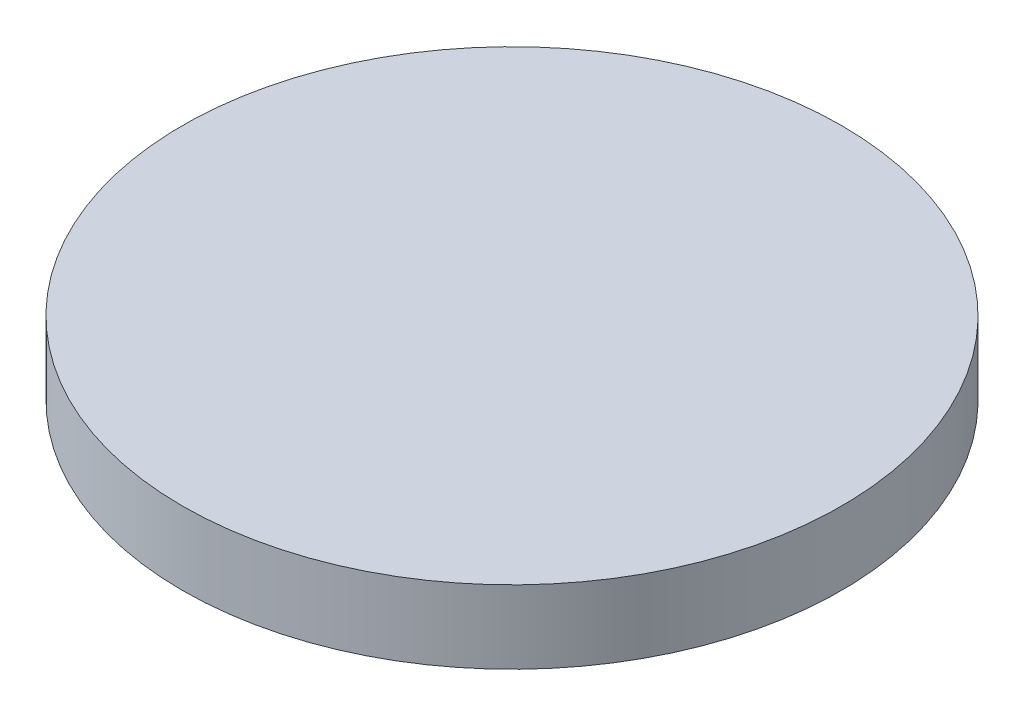
ISO-10303-21;
HEADER;
FILE_DESCRIPTION(('STEP AP214'),'2;1');
FILE_NAME('part.step','',(''),(''),'','','');
FILE_SCHEMA(('AUTOMOTIVE_DESIGN { 1 0 10303 214 1 1 1 1 }'));
ENDSEC;
DATA;
#1=APPLICATION_CONTEXT('core data for automotive mechanical design processes');
#2=APPLICATION_PROTOCOL_DEFINITION('international standard','automotive_design',2000,#1);
#3=PRODUCT_CONTEXT('',#1,'mechanical');
#4=PRODUCT('Part','Part','',(#3));
#5=PRODUCT_RELATED_PRODUCT_CATEGORY('part','',(#4));
#6=PRODUCT_DEFINITION_FORMATION('','',#4);
#7=PRODUCT_DEFINITION_CONTEXT('part definition',#1,'design');
#8=PRODUCT_DEFINITION('design','',#6,#7);
#9=PRODUCT_DEFINITION_SHAPE('','',#8);
#10=(LENGTH_UNIT() NAMED_UNIT(*) SI_UNIT(.MILLI.,.METRE.));
#11=(NAMED_UNIT(*) PLANE_ANGLE_UNIT() SI_UNIT($,.RADIAN.));
#12=(NAMED_UNIT(*) SI_UNIT($,.STERADIAN.) SOLID_ANGLE_UNIT());
#13=UNCERTAINTY_MEASURE_WITH_UNIT(LENGTH_MEASURE(1.E-05),#10,'distance_accuracy_value','');
#14=(GEOMETRIC_REPRESENTATION_CONTEXT(3) GLOBAL_UNCERTAINTY_ASSIGNED_CONTEXT((#13)) GLOBAL_UNIT_ASSIGNED_CONTEXT((#10,
#11,#12)) REPRESENTATION_CONTEXT('',''));
#15=CARTESIAN_POINT('',(0.,0.,0.));
#16=DIRECTION('',(0.,0.,1.));
#17=DIRECTION('',(1.,0.,0.));
#18=AXIS2_PLACEMENT_3D('',#15,#16,#17);
#19=CARTESIAN_POINT('',(0.,0.,5.5));
#20=DIRECTION('',(0.,-1.,0.));
#21=DIRECTION('',(0.,0.,-1.));
#22=AXIS2_PLACEMENT_3D('',#19,#20,#21);
#23=CYLINDRICAL_SURFACE('',#22,10.);
#24=CARTESIAN_POINT('',(0.,2.21893410709426,5.5));
#25=DIRECTION('',(0.,-1.,0.));
#26=DIRECTION('',(0.,0.,-1.));
#27=AXIS2_PLACEMENT_3D('',#24,#25,#26);
#28=CIRCLE('',#27,10.);
#29=CARTESIAN_POINT('',(0.,2.21893410709426,-4.5));
#30=VERTEX_POINT('',#29);
#31=EDGE_CURVE('E37',#30,#30,#28,.T.);
#32=ORIENTED_EDGE('',*,*,#31,.T.);
#33=EDGE_LOOP('',(#32));
#34=FACE_BOUND('',#33,.T.);
#35=CARTESIAN_POINT('',(0.,0.,5.5));
#36=DIRECTION('',(0.,-1.,0.));
#37=DIRECTION('',(0.,0.,-1.));
#38=AXIS2_PLACEMENT_3D('',#35,#36,#37);
#39=CIRCLE('',#38,10.);
#40=CARTESIAN_POINT('',(0.,0.,-4.5));
#41=VERTEX_POINT('',#40);
#42=EDGE_CURVE('E10',#41,#41,#39,.T.);
#43=ORIENTED_EDGE('',*,*,#42,.F.);
#44=EDGE_LOOP('',(#43));
#45=FACE_BOUND('',#44,.T.);
#46=ADVANCED_FACE('F31',(#34,#45),#23,.T.);
#47=CARTESIAN_POINT('',(0.,0.,-4.5));
#48=DIRECTION('',(0.,1.,0.));
#49=DIRECTION('',(0.,0.,1.));
#50=AXIS2_PLACEMENT_3D('',#47,#48,#49);
#51=PLANE('',#50);
#52=ORIENTED_EDGE('',*,*,#42,.T.);
#53=EDGE_LOOP('',(#52));
#54=FACE_BOUND('',#53,.T.);
#55=ADVANCED_FACE('F47',(#54),#51,.F.);
#56=CARTESIAN_POINT('',(0.,2.21893410709426,5.5));
#57=DIRECTION('',(0.,-1.,0.));
#58=DIRECTION('',(0.,0.,-1.));
#59=AXIS2_PLACEMENT_3D('',#56,#57,#58);
#60=PLANE('',#59);
#61=ORIENTED_EDGE('',*,*,#31,.F.);
#62=EDGE_LOOP('',(#61));
#63=FACE_BOUND('',#62,.T.);
#64=ADVANCED_FACE('F45',(#63),#60,.F.);
#65=CLOSED_SHELL('',(#46,#55,#64));
#66=MANIFOLD_SOLID_BREP('B2',#65);
#67=ADVANCED_BREP_SHAPE_REPRESENTATION('',(#18,#66),#14);
#68=SHAPE_DEFINITION_REPRESENTATION(#9,#67);
ENDSEC;
END-ISO-10303-21;
